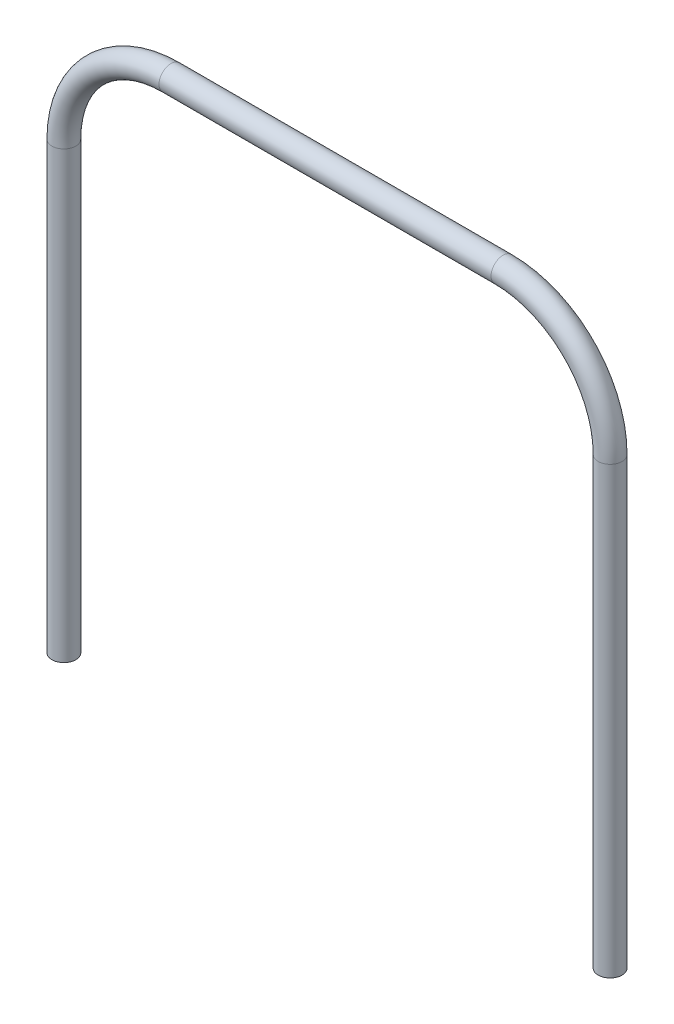
ISO-10303-21;
HEADER;
FILE_DESCRIPTION(('STEP AP214'),'2;1');
FILE_NAME('part.step','',(''),(''),'','','');
FILE_SCHEMA(('AUTOMOTIVE_DESIGN { 1 0 10303 214 1 1 1 1 }'));
ENDSEC;
DATA;
#1=APPLICATION_CONTEXT('core data for automotive mechanical design processes');
#2=APPLICATION_PROTOCOL_DEFINITION('international standard','automotive_design',2000,#1);
#3=PRODUCT_CONTEXT('',#1,'mechanical');
#4=PRODUCT('Part','Part','',(#3));
#5=PRODUCT_RELATED_PRODUCT_CATEGORY('part','',(#4));
#6=PRODUCT_DEFINITION_FORMATION('','',#4);
#7=PRODUCT_DEFINITION_CONTEXT('part definition',#1,'design');
#8=PRODUCT_DEFINITION('design','',#6,#7);
#9=PRODUCT_DEFINITION_SHAPE('','',#8);
#10=(LENGTH_UNIT() NAMED_UNIT(*) SI_UNIT(.MILLI.,.METRE.));
#11=(NAMED_UNIT(*) PLANE_ANGLE_UNIT() SI_UNIT($,.RADIAN.));
#12=(NAMED_UNIT(*) SI_UNIT($,.STERADIAN.) SOLID_ANGLE_UNIT());
#13=UNCERTAINTY_MEASURE_WITH_UNIT(LENGTH_MEASURE(1.E-05),#10,'distance_accuracy_value','');
#14=(GEOMETRIC_REPRESENTATION_CONTEXT(3) GLOBAL_UNCERTAINTY_ASSIGNED_CONTEXT((#13)) GLOBAL_UNIT_ASSIGNED_CONTEXT((#10,
#11,#12)) REPRESENTATION_CONTEXT('',''));
#15=CARTESIAN_POINT('',(0.,0.,0.));
#16=DIRECTION('',(0.,0.,1.));
#17=DIRECTION('',(1.,0.,0.));
#18=AXIS2_PLACEMENT_3D('',#15,#16,#17);
#19=CARTESIAN_POINT('',(0.,0.,0.));
#20=DIRECTION('',(0.,1.,0.));
#21=DIRECTION('',(0.,0.,1.));
#22=AXIS2_PLACEMENT_3D('',#19,#20,#21);
#23=CYLINDRICAL_SURFACE('',#22,19.);
#24=CARTESIAN_POINT('',(0.,706.,0.));
#25=DIRECTION('',(0.,1.,0.));
#26=DIRECTION('',(0.,0.,1.));
#27=AXIS2_PLACEMENT_3D('',#24,#25,#26);
#28=CIRCLE('',#27,19.);
#29=CARTESIAN_POINT('',(-19.0000000000001,706.,0.));
#30=VERTEX_POINT('',#29);
#31=EDGE_CURVE('E82',#30,#30,#28,.T.);
#32=ORIENTED_EDGE('',*,*,#31,.F.);
#33=EDGE_LOOP('',(#32));
#34=FACE_BOUND('',#33,.T.);
#35=CARTESIAN_POINT('',(0.,0.,0.));
#36=DIRECTION('',(0.,1.,0.));
#37=DIRECTION('',(0.,0.,1.));
#38=AXIS2_PLACEMENT_3D('',#35,#36,#37);
#39=CIRCLE('',#38,19.);
#40=CARTESIAN_POINT('',(0.,0.,19.));
#41=VERTEX_POINT('',#40);
#42=EDGE_CURVE('E49',#41,#41,#39,.T.);
#43=ORIENTED_EDGE('',*,*,#42,.T.);
#44=EDGE_LOOP('',(#43));
#45=FACE_BOUND('',#44,.T.);
#46=ADVANCED_FACE('F34',(#34,#45),#23,.T.);
#47=CARTESIAN_POINT('',(170.,706.,0.));
#48=DIRECTION('',(0.,0.,-1.));
#49=DIRECTION('',(-1.,0.,0.));
#50=AXIS2_PLACEMENT_3D('',#47,#48,#49);
#51=TOROIDAL_SURFACE('',#50,170.,19.);
#52=CARTESIAN_POINT('',(170.,876.,0.));
#53=DIRECTION('',(1.,0.,0.));
#54=DIRECTION('',(0.,0.,1.));
#55=AXIS2_PLACEMENT_3D('',#52,#53,#54);
#56=CIRCLE('',#55,19.);
#57=CARTESIAN_POINT('',(170.,895.,0.));
#58=VERTEX_POINT('',#57);
#59=EDGE_CURVE('E85',#58,#58,#56,.T.);
#60=CARTESIAN_POINT('',(170.,706.,0.));
#61=DIRECTION('',(0.,0.,-1.));
#62=DIRECTION('',(-1.,0.,0.));
#63=AXIS2_PLACEMENT_3D('',#60,#61,#62);
#64=CIRCLE('',#63,189.);
#65=EDGE_CURVE('',#30,#58,#64,.T.);
#66=ORIENTED_EDGE('',*,*,#31,.T.);
#67=ORIENTED_EDGE('',*,*,#59,.F.);
#68=ORIENTED_EDGE('',*,*,#65,.T.);
#69=ORIENTED_EDGE('',*,*,#65,.F.);
#70=EDGE_LOOP('',(#66,#68,#67,#69));
#71=FACE_BOUND('',#70,.T.);
#72=ADVANCED_FACE('F103',(#71),#51,.T.);
#73=CARTESIAN_POINT('',(170.,876.,0.));
#74=DIRECTION('',(1.,0.,0.));
#75=DIRECTION('',(0.,0.,-1.));
#76=AXIS2_PLACEMENT_3D('',#73,#74,#75);
#77=CYLINDRICAL_SURFACE('',#76,19.);
#78=CARTESIAN_POINT('',(697.,876.,0.));
#79=DIRECTION('',(1.,0.,0.));
#80=DIRECTION('',(0.,0.,1.));
#81=AXIS2_PLACEMENT_3D('',#78,#79,#80);
#82=CIRCLE('',#81,19.);
#83=CARTESIAN_POINT('',(697.,895.,0.));
#84=VERTEX_POINT('',#83);
#85=EDGE_CURVE('E87',#84,#84,#82,.T.);
#86=ORIENTED_EDGE('',*,*,#85,.F.);
#87=EDGE_LOOP('',(#86));
#88=FACE_BOUND('',#87,.T.);
#89=ORIENTED_EDGE('',*,*,#59,.T.);
#90=EDGE_LOOP('',(#89));
#91=FACE_BOUND('',#90,.T.);
#92=ADVANCED_FACE('F97',(#88,#91),#77,.T.);
#93=CARTESIAN_POINT('',(697.,706.,0.));
#94=DIRECTION('',(0.,0.,-1.));
#95=DIRECTION('',(-1.,0.,0.));
#96=AXIS2_PLACEMENT_3D('',#93,#94,#95);
#97=TOROIDAL_SURFACE('',#96,170.,19.);
#98=CARTESIAN_POINT('',(867.,706.,0.));
#99=DIRECTION('',(0.,-1.,0.));
#100=DIRECTION('',(0.,0.,1.));
#101=AXIS2_PLACEMENT_3D('',#98,#99,#100);
#102=CIRCLE('',#101,19.);
#103=CARTESIAN_POINT('',(886.,706.,0.));
#104=VERTEX_POINT('',#103);
#105=EDGE_CURVE('E38',#104,#104,#102,.T.);
#106=CARTESIAN_POINT('',(697.,706.,0.));
#107=DIRECTION('',(0.,0.,-1.));
#108=DIRECTION('',(-1.,0.,0.));
#109=AXIS2_PLACEMENT_3D('',#106,#107,#108);
#110=CIRCLE('',#109,189.);
#111=EDGE_CURVE('',#84,#104,#110,.T.);
#112=ORIENTED_EDGE('',*,*,#85,.T.);
#113=ORIENTED_EDGE('',*,*,#105,.F.);
#114=ORIENTED_EDGE('',*,*,#111,.T.);
#115=ORIENTED_EDGE('',*,*,#111,.F.);
#116=EDGE_LOOP('',(#112,#114,#113,#115));
#117=FACE_BOUND('',#116,.T.);
#118=ADVANCED_FACE('F95',(#117),#97,.T.);
#119=CARTESIAN_POINT('',(867.,706.,0.));
#120=DIRECTION('',(0.,-1.,0.));
#121=DIRECTION('',(1.,0.,0.));
#122=AXIS2_PLACEMENT_3D('',#119,#120,#121);
#123=CYLINDRICAL_SURFACE('',#122,19.);
#124=CARTESIAN_POINT('',(867.,1.11022302462516E-13,0.));
#125=DIRECTION('',(0.,-1.,0.));
#126=DIRECTION('',(0.,0.,1.));
#127=AXIS2_PLACEMENT_3D('',#124,#125,#126);
#128=CIRCLE('',#127,19.);
#129=CARTESIAN_POINT('',(867.,1.11022302462516E-13,19.));
#130=VERTEX_POINT('',#129);
#131=EDGE_CURVE('E54',#130,#130,#128,.T.);
#132=ORIENTED_EDGE('',*,*,#131,.F.);
#133=EDGE_LOOP('',(#132));
#134=FACE_BOUND('',#133,.T.);
#135=ORIENTED_EDGE('',*,*,#105,.T.);
#136=EDGE_LOOP('',(#135));
#137=FACE_BOUND('',#136,.T.);
#138=ADVANCED_FACE('F36',(#134,#137),#123,.T.);
#139=CARTESIAN_POINT('',(0.,0.,0.));
#140=DIRECTION('',(0.,1.,0.));
#141=DIRECTION('',(0.,0.,1.));
#142=AXIS2_PLACEMENT_3D('',#139,#140,#141);
#143=PLANE('',#142);
#144=CARTESIAN_POINT('',(0.,0.,0.));
#145=DIRECTION('',(0.,1.,0.));
#146=DIRECTION('',(0.,0.,1.));
#147=AXIS2_PLACEMENT_3D('',#144,#145,#146);
#148=CIRCLE('',#147,17.8);
#149=CARTESIAN_POINT('',(0.,0.,17.8));
#150=VERTEX_POINT('',#149);
#151=EDGE_CURVE('E80',#150,#150,#148,.F.);
#152=ORIENTED_EDGE('',*,*,#151,.F.);
#153=EDGE_LOOP('',(#152));
#154=FACE_BOUND('',#153,.T.);
#155=ORIENTED_EDGE('',*,*,#42,.F.);
#156=EDGE_LOOP('',(#155));
#157=FACE_BOUND('',#156,.T.);
#158=ADVANCED_FACE('F102',(#154,#157),#143,.F.);
#159=CARTESIAN_POINT('',(867.,1.11022302462516E-13,0.));
#160=DIRECTION('',(0.,-1.,0.));
#161=DIRECTION('',(0.,0.,1.));
#162=AXIS2_PLACEMENT_3D('',#159,#160,#161);
#163=PLANE('',#162);
#164=CARTESIAN_POINT('',(867.,1.11022302462516E-13,0.));
#165=DIRECTION('',(0.,-1.,0.));
#166=DIRECTION('',(0.,0.,1.));
#167=AXIS2_PLACEMENT_3D('',#164,#165,#166);
#168=CIRCLE('',#167,17.8);
#169=CARTESIAN_POINT('',(867.,1.11022302462516E-13,17.8));
#170=VERTEX_POINT('',#169);
#171=EDGE_CURVE('E11',#170,#170,#168,.F.);
#172=ORIENTED_EDGE('',*,*,#171,.T.);
#173=EDGE_LOOP('',(#172));
#174=FACE_BOUND('',#173,.T.);
#175=ORIENTED_EDGE('',*,*,#131,.T.);
#176=EDGE_LOOP('',(#175));
#177=FACE_BOUND('',#176,.T.);
#178=ADVANCED_FACE('F61',(#174,#177),#163,.T.);
#179=CARTESIAN_POINT('',(0.,0.,0.));
#180=DIRECTION('',(0.,1.,0.));
#181=DIRECTION('',(0.,0.,1.));
#182=AXIS2_PLACEMENT_3D('',#179,#180,#181);
#183=CYLINDRICAL_SURFACE('',#182,17.8);
#184=CARTESIAN_POINT('',(0.,706.,0.));
#185=DIRECTION('',(0.,1.,0.));
#186=DIRECTION('',(0.,0.,1.));
#187=AXIS2_PLACEMENT_3D('',#184,#185,#186);
#188=CIRCLE('',#187,17.8);
#189=CARTESIAN_POINT('',(-17.8000000000001,706.,0.));
#190=VERTEX_POINT('',#189);
#191=EDGE_CURVE('E136',#190,#190,#188,.F.);
#192=ORIENTED_EDGE('',*,*,#191,.F.);
#193=EDGE_LOOP('',(#192));
#194=FACE_BOUND('',#193,.T.);
#195=ORIENTED_EDGE('',*,*,#151,.T.);
#196=EDGE_LOOP('',(#195));
#197=FACE_BOUND('',#196,.T.);
#198=ADVANCED_FACE('F117',(#194,#197),#183,.F.);
#199=CARTESIAN_POINT('',(170.,706.,0.));
#200=DIRECTION('',(0.,0.,-1.));
#201=DIRECTION('',(-1.,0.,0.));
#202=AXIS2_PLACEMENT_3D('',#199,#200,#201);
#203=TOROIDAL_SURFACE('',#202,170.,17.8);
#204=CARTESIAN_POINT('',(170.,876.,0.));
#205=DIRECTION('',(1.,0.,0.));
#206=DIRECTION('',(0.,0.,1.));
#207=AXIS2_PLACEMENT_3D('',#204,#205,#206);
#208=CIRCLE('',#207,17.8);
#209=CARTESIAN_POINT('',(170.,893.8,0.));
#210=VERTEX_POINT('',#209);
#211=EDGE_CURVE('E75',#210,#210,#208,.F.);
#212=CARTESIAN_POINT('',(170.,706.,0.));
#213=DIRECTION('',(0.,0.,-1.));
#214=DIRECTION('',(-1.,0.,0.));
#215=AXIS2_PLACEMENT_3D('',#212,#213,#214);
#216=CIRCLE('',#215,187.8);
#217=EDGE_CURVE('',#190,#210,#216,.T.);
#218=ORIENTED_EDGE('',*,*,#191,.T.);
#219=ORIENTED_EDGE('',*,*,#211,.F.);
#220=ORIENTED_EDGE('',*,*,#217,.T.);
#221=ORIENTED_EDGE('',*,*,#217,.F.);
#222=EDGE_LOOP('',(#218,#220,#219,#221));
#223=FACE_BOUND('',#222,.T.);
#224=ADVANCED_FACE('F124',(#223),#203,.F.);
#225=CARTESIAN_POINT('',(170.,876.,0.));
#226=DIRECTION('',(1.,0.,0.));
#227=DIRECTION('',(0.,0.,-1.));
#228=AXIS2_PLACEMENT_3D('',#225,#226,#227);
#229=CYLINDRICAL_SURFACE('',#228,17.8);
#230=CARTESIAN_POINT('',(697.,876.,0.));
#231=DIRECTION('',(1.,0.,0.));
#232=DIRECTION('',(0.,0.,1.));
#233=AXIS2_PLACEMENT_3D('',#230,#231,#232);
#234=CIRCLE('',#233,17.8);
#235=CARTESIAN_POINT('',(697.,893.8,0.));
#236=VERTEX_POINT('',#235);
#237=EDGE_CURVE('E72',#236,#236,#234,.F.);
#238=ORIENTED_EDGE('',*,*,#237,.F.);
#239=EDGE_LOOP('',(#238));
#240=FACE_BOUND('',#239,.T.);
#241=ORIENTED_EDGE('',*,*,#211,.T.);
#242=EDGE_LOOP('',(#241));
#243=FACE_BOUND('',#242,.T.);
#244=ADVANCED_FACE('F121',(#240,#243),#229,.F.);
#245=CARTESIAN_POINT('',(697.,706.,0.));
#246=DIRECTION('',(0.,0.,-1.));
#247=DIRECTION('',(-1.,0.,0.));
#248=AXIS2_PLACEMENT_3D('',#245,#246,#247);
#249=TOROIDAL_SURFACE('',#248,170.,17.8);
#250=CARTESIAN_POINT('',(867.,706.,0.));
#251=DIRECTION('',(0.,-1.,0.));
#252=DIRECTION('',(0.,0.,1.));
#253=AXIS2_PLACEMENT_3D('',#250,#251,#252);
#254=CIRCLE('',#253,17.8);
#255=CARTESIAN_POINT('',(884.8,706.,0.));
#256=VERTEX_POINT('',#255);
#257=EDGE_CURVE('E43',#256,#256,#254,.F.);
#258=CARTESIAN_POINT('',(697.,706.,0.));
#259=DIRECTION('',(0.,0.,-1.));
#260=DIRECTION('',(-1.,0.,0.));
#261=AXIS2_PLACEMENT_3D('',#258,#259,#260);
#262=CIRCLE('',#261,187.8);
#263=EDGE_CURVE('',#236,#256,#262,.T.);
#264=ORIENTED_EDGE('',*,*,#237,.T.);
#265=ORIENTED_EDGE('',*,*,#257,.F.);
#266=ORIENTED_EDGE('',*,*,#263,.T.);
#267=ORIENTED_EDGE('',*,*,#263,.F.);
#268=EDGE_LOOP('',(#264,#266,#265,#267));
#269=FACE_BOUND('',#268,.T.);
#270=ADVANCED_FACE('F67',(#269),#249,.F.);
#271=CARTESIAN_POINT('',(867.,706.,0.));
#272=DIRECTION('',(0.,-1.,0.));
#273=DIRECTION('',(1.,0.,0.));
#274=AXIS2_PLACEMENT_3D('',#271,#272,#273);
#275=CYLINDRICAL_SURFACE('',#274,17.8);
#276=ORIENTED_EDGE('',*,*,#171,.F.);
#277=EDGE_LOOP('',(#276));
#278=FACE_BOUND('',#277,.T.);
#279=ORIENTED_EDGE('',*,*,#257,.T.);
#280=EDGE_LOOP('',(#279));
#281=FACE_BOUND('',#280,.T.);
#282=ADVANCED_FACE('F64',(#278,#281),#275,.F.);
#283=CLOSED_SHELL('',(#46,#72,#92,#118,#138,#158,#178,#198,#224,#244,#270,#282));
#284=MANIFOLD_SOLID_BREP('B2',#283);
#285=ADVANCED_BREP_SHAPE_REPRESENTATION('',(#18,#284),#14);
#286=SHAPE_DEFINITION_REPRESENTATION(#9,#285);
ENDSEC;
END-ISO-10303-21;
